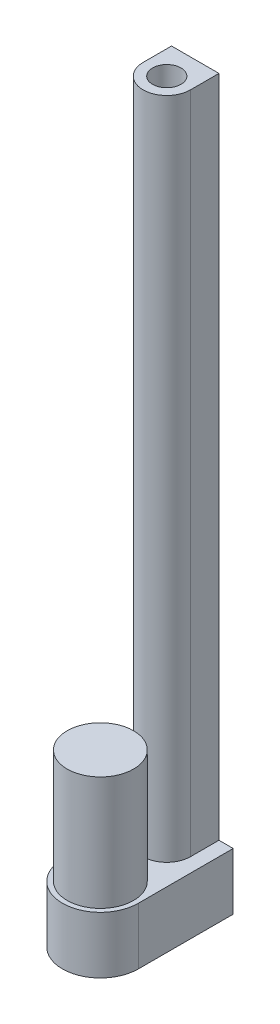
ISO-10303-21;
HEADER;
FILE_DESCRIPTION(('STEP AP214'),'2;1');
FILE_NAME('part.step','',(''),(''),'','','');
FILE_SCHEMA(('AUTOMOTIVE_DESIGN { 1 0 10303 214 1 1 1 1 }'));
ENDSEC;
DATA;
#1=APPLICATION_CONTEXT('core data for automotive mechanical design processes');
#2=APPLICATION_PROTOCOL_DEFINITION('international standard','automotive_design',2000,#1);
#3=PRODUCT_CONTEXT('',#1,'mechanical');
#4=PRODUCT('Part','Part','',(#3));
#5=PRODUCT_RELATED_PRODUCT_CATEGORY('part','',(#4));
#6=PRODUCT_DEFINITION_FORMATION('','',#4);
#7=PRODUCT_DEFINITION_CONTEXT('part definition',#1,'design');
#8=PRODUCT_DEFINITION('design','',#6,#7);
#9=PRODUCT_DEFINITION_SHAPE('','',#8);
#10=(LENGTH_UNIT() NAMED_UNIT(*) SI_UNIT(.MILLI.,.METRE.));
#11=(NAMED_UNIT(*) PLANE_ANGLE_UNIT() SI_UNIT($,.RADIAN.));
#12=(NAMED_UNIT(*) SI_UNIT($,.STERADIAN.) SOLID_ANGLE_UNIT());
#13=UNCERTAINTY_MEASURE_WITH_UNIT(LENGTH_MEASURE(1.E-05),#10,'distance_accuracy_value','');
#14=(GEOMETRIC_REPRESENTATION_CONTEXT(3) GLOBAL_UNCERTAINTY_ASSIGNED_CONTEXT((#13)) GLOBAL_UNIT_ASSIGNED_CONTEXT((#10,
#11,#12)) REPRESENTATION_CONTEXT('',''));
#15=CARTESIAN_POINT('',(0.,0.,0.));
#16=DIRECTION('',(0.,0.,1.));
#17=DIRECTION('',(1.,0.,0.));
#18=AXIS2_PLACEMENT_3D('',#15,#16,#17);
#19=CARTESIAN_POINT('',(0.,0.,50.));
#20=DIRECTION('',(0.,-1.,0.));
#21=DIRECTION('',(0.,0.,-1.));
#22=AXIS2_PLACEMENT_3D('',#19,#20,#21);
#23=PLANE('',#22);
#24=CARTESIAN_POINT('',(0.,0.,50.));
#25=DIRECTION('',(0.,1.,0.));
#26=DIRECTION('',(0.,0.,-1.));
#27=AXIS2_PLACEMENT_3D('',#24,#25,#26);
#28=CIRCLE('',#27,20.);
#29=CARTESIAN_POINT('',(-20.,0.,50.));
#30=VERTEX_POINT('',#29);
#31=CARTESIAN_POINT('',(20.,0.,50.));
#32=VERTEX_POINT('',#31);
#33=EDGE_CURVE('E215',#30,#32,#28,.T.);
#34=ORIENTED_EDGE('',*,*,#33,.F.);
#35=DIRECTION('',(0.,0.,1.));
#36=VECTOR('',#35,1.);
#37=CARTESIAN_POINT('',(-20.,0.,50.));
#38=LINE('',#37,#36);
#39=CARTESIAN_POINT('',(-20.,0.,0.));
#40=VERTEX_POINT('',#39);
#41=EDGE_CURVE('E221',#40,#30,#38,.T.);
#42=ORIENTED_EDGE('',*,*,#41,.F.);
#43=DIRECTION('',(-1.,0.,0.));
#44=VECTOR('',#43,1.);
#45=CARTESIAN_POINT('',(-20.,0.,0.));
#46=LINE('',#45,#44);
#47=CARTESIAN_POINT('',(20.,0.,0.));
#48=VERTEX_POINT('',#47);
#49=EDGE_CURVE('E238',#48,#40,#46,.T.);
#50=ORIENTED_EDGE('',*,*,#49,.F.);
#51=DIRECTION('',(0.,0.,-1.));
#52=VECTOR('',#51,1.);
#53=CARTESIAN_POINT('',(20.,0.,0.));
#54=LINE('',#53,#52);
#55=EDGE_CURVE('E235',#32,#48,#54,.T.);
#56=ORIENTED_EDGE('',*,*,#55,.F.);
#57=EDGE_LOOP('',(#34,#42,#50,#56));
#58=FACE_BOUND('',#57,.T.);
#59=DIRECTION('',(1.,0.,0.));
#60=VECTOR('',#59,1.);
#61=CARTESIAN_POINT('',(5.,0.,4.99999999999999));
#62=LINE('',#61,#60);
#63=CARTESIAN_POINT('',(-5.,0.,4.99999999999999));
#64=VERTEX_POINT('',#63);
#65=CARTESIAN_POINT('',(5.,0.,4.99999999999999));
#66=VERTEX_POINT('',#65);
#67=EDGE_CURVE('E426',#64,#66,#62,.T.);
#68=ORIENTED_EDGE('',*,*,#67,.F.);
#69=DIRECTION('',(0.,0.,-1.));
#70=VECTOR('',#69,1.);
#71=CARTESIAN_POINT('',(-5.,0.,4.99999999999999));
#72=LINE('',#71,#70);
#73=CARTESIAN_POINT('',(-5.,0.,15.));
#74=VERTEX_POINT('',#73);
#75=EDGE_CURVE('E161',#74,#64,#72,.T.);
#76=ORIENTED_EDGE('',*,*,#75,.F.);
#77=DIRECTION('',(-1.,0.,0.));
#78=VECTOR('',#77,1.);
#79=CARTESIAN_POINT('',(5.,0.,15.));
#80=LINE('',#79,#78);
#81=CARTESIAN_POINT('',(5.,0.,15.));
#82=VERTEX_POINT('',#81);
#83=EDGE_CURVE('E157',#82,#74,#80,.T.);
#84=ORIENTED_EDGE('',*,*,#83,.F.);
#85=DIRECTION('',(0.,0.,1.));
#86=VECTOR('',#85,1.);
#87=CARTESIAN_POINT('',(5.,0.,4.99999999999999));
#88=LINE('',#87,#86);
#89=EDGE_CURVE('E437',#66,#82,#88,.T.);
#90=ORIENTED_EDGE('',*,*,#89,.F.);
#91=EDGE_LOOP('',(#68,#76,#84,#90));
#92=FACE_BOUND('',#91,.T.);
#93=ADVANCED_FACE('F45',(#58,#92),#23,.T.);
#94=CARTESIAN_POINT('',(0.,30.,50.));
#95=DIRECTION('',(0.,-1.,0.));
#96=DIRECTION('',(0.,0.,-1.));
#97=AXIS2_PLACEMENT_3D('',#94,#95,#96);
#98=PLANE('',#97);
#99=CARTESIAN_POINT('',(0.,30.,50.));
#100=DIRECTION('',(0.,-1.,0.));
#101=DIRECTION('',(0.,0.,-1.));
#102=AXIS2_PLACEMENT_3D('',#99,#100,#101);
#103=CIRCLE('',#102,17.5);
#104=CARTESIAN_POINT('',(0.,30.,32.5));
#105=VERTEX_POINT('',#104);
#106=EDGE_CURVE('E11',#105,#105,#103,.F.);
#107=ORIENTED_EDGE('',*,*,#106,.F.);
#108=EDGE_LOOP('',(#107));
#109=FACE_BOUND('',#108,.T.);
#110=DIRECTION('',(0.,0.,1.));
#111=VECTOR('',#110,1.);
#112=CARTESIAN_POINT('',(-12.5,30.,0.));
#113=LINE('',#112,#111);
#114=CARTESIAN_POINT('',(-12.5,30.,0.));
#115=VERTEX_POINT('',#114);
#116=CARTESIAN_POINT('',(-12.5,30.,15.));
#117=VERTEX_POINT('',#116);
#118=EDGE_CURVE('E188',#115,#117,#113,.T.);
#119=ORIENTED_EDGE('',*,*,#118,.F.);
#120=DIRECTION('',(-1.,0.,0.));
#121=VECTOR('',#120,1.);
#122=CARTESIAN_POINT('',(-20.,30.,0.));
#123=LINE('',#122,#121);
#124=CARTESIAN_POINT('',(-20.,30.,0.));
#125=VERTEX_POINT('',#124);
#126=EDGE_CURVE('E224',#115,#125,#123,.T.);
#127=ORIENTED_EDGE('',*,*,#126,.T.);
#128=DIRECTION('',(0.,0.,1.));
#129=VECTOR('',#128,1.);
#130=CARTESIAN_POINT('',(-20.,30.,50.));
#131=LINE('',#130,#129);
#132=CARTESIAN_POINT('',(-20.,30.,50.));
#133=VERTEX_POINT('',#132);
#134=EDGE_CURVE('E228',#125,#133,#131,.T.);
#135=ORIENTED_EDGE('',*,*,#134,.T.);
#136=CARTESIAN_POINT('',(0.,30.,50.));
#137=DIRECTION('',(0.,1.,0.));
#138=DIRECTION('',(0.,0.,-1.));
#139=AXIS2_PLACEMENT_3D('',#136,#137,#138);
#140=CIRCLE('',#139,20.);
#141=CARTESIAN_POINT('',(20.,30.,50.));
#142=VERTEX_POINT('',#141);
#143=EDGE_CURVE('E216',#133,#142,#140,.T.);
#144=ORIENTED_EDGE('',*,*,#143,.T.);
#145=DIRECTION('',(0.,0.,-1.));
#146=VECTOR('',#145,1.);
#147=CARTESIAN_POINT('',(20.,30.,0.));
#148=LINE('',#147,#146);
#149=CARTESIAN_POINT('',(20.,30.,0.));
#150=VERTEX_POINT('',#149);
#151=EDGE_CURVE('E220',#142,#150,#148,.T.);
#152=ORIENTED_EDGE('',*,*,#151,.T.);
#153=CARTESIAN_POINT('',(12.5,30.,0.));
#154=VERTEX_POINT('',#153);
#155=EDGE_CURVE('E225',#150,#154,#123,.T.);
#156=ORIENTED_EDGE('',*,*,#155,.T.);
#157=DIRECTION('',(0.,0.,-1.));
#158=VECTOR('',#157,1.);
#159=CARTESIAN_POINT('',(12.5,30.,15.));
#160=LINE('',#159,#158);
#161=CARTESIAN_POINT('',(12.5,30.,15.));
#162=VERTEX_POINT('',#161);
#163=EDGE_CURVE('E178',#162,#154,#160,.T.);
#164=ORIENTED_EDGE('',*,*,#163,.F.);
#165=CARTESIAN_POINT('',(0.,30.,15.));
#166=DIRECTION('',(0.,1.,0.));
#167=DIRECTION('',(0.,0.,1.));
#168=AXIS2_PLACEMENT_3D('',#165,#166,#167);
#169=CIRCLE('',#168,12.5);
#170=EDGE_CURVE('E70',#117,#162,#169,.T.);
#171=ORIENTED_EDGE('',*,*,#170,.F.);
#172=EDGE_LOOP('',(#119,#127,#135,#144,#152,#156,#164,#171));
#173=FACE_BOUND('',#172,.T.);
#174=ADVANCED_FACE('F276',(#109,#173),#98,.F.);
#175=CARTESIAN_POINT('',(0.,30.,50.));
#176=DIRECTION('',(0.,-1.,0.));
#177=DIRECTION('',(0.,0.,-1.));
#178=AXIS2_PLACEMENT_3D('',#175,#176,#177);
#179=CYLINDRICAL_SURFACE('',#178,20.);
#180=ORIENTED_EDGE('',*,*,#33,.T.);
#181=DIRECTION('',(0.,-1.,0.));
#182=VECTOR('',#181,1.);
#183=CARTESIAN_POINT('',(20.,30.,50.));
#184=LINE('',#183,#182);
#185=EDGE_CURVE('E55',#142,#32,#184,.T.);
#186=ORIENTED_EDGE('',*,*,#185,.F.);
#187=ORIENTED_EDGE('',*,*,#143,.F.);
#188=DIRECTION('',(0.,-1.,0.));
#189=VECTOR('',#188,1.);
#190=CARTESIAN_POINT('',(-20.,30.,50.));
#191=LINE('',#190,#189);
#192=EDGE_CURVE('E231',#133,#30,#191,.T.);
#193=ORIENTED_EDGE('',*,*,#192,.T.);
#194=EDGE_LOOP('',(#180,#186,#187,#193));
#195=FACE_BOUND('',#194,.T.);
#196=ADVANCED_FACE('F47',(#195),#179,.T.);
#197=CARTESIAN_POINT('',(20.,30.,0.));
#198=DIRECTION('',(-1.,0.,0.));
#199=DIRECTION('',(0.,0.,1.));
#200=AXIS2_PLACEMENT_3D('',#197,#198,#199);
#201=PLANE('',#200);
#202=ORIENTED_EDGE('',*,*,#55,.T.);
#203=DIRECTION('',(0.,-1.,0.));
#204=VECTOR('',#203,1.);
#205=CARTESIAN_POINT('',(20.,30.,0.));
#206=LINE('',#205,#204);
#207=EDGE_CURVE('E250',#150,#48,#206,.T.);
#208=ORIENTED_EDGE('',*,*,#207,.F.);
#209=ORIENTED_EDGE('',*,*,#151,.F.);
#210=ORIENTED_EDGE('',*,*,#185,.T.);
#211=EDGE_LOOP('',(#202,#208,#209,#210));
#212=FACE_BOUND('',#211,.T.);
#213=ADVANCED_FACE('F258',(#212),#201,.F.);
#214=CARTESIAN_POINT('',(-20.,30.,0.));
#215=DIRECTION('',(0.,0.,1.));
#216=DIRECTION('',(1.,0.,0.));
#217=AXIS2_PLACEMENT_3D('',#214,#215,#216);
#218=PLANE('',#217);
#219=ORIENTED_EDGE('',*,*,#49,.T.);
#220=DIRECTION('',(0.,-1.,0.));
#221=VECTOR('',#220,1.);
#222=CARTESIAN_POINT('',(-20.,30.,0.));
#223=LINE('',#222,#221);
#224=EDGE_CURVE('E246',#125,#40,#223,.T.);
#225=ORIENTED_EDGE('',*,*,#224,.F.);
#226=ORIENTED_EDGE('',*,*,#126,.F.);
#227=DIRECTION('',(0.,-1.,0.));
#228=VECTOR('',#227,1.);
#229=CARTESIAN_POINT('',(-12.5,380.,0.));
#230=LINE('',#229,#228);
#231=CARTESIAN_POINT('',(-12.5,380.,0.));
#232=VERTEX_POINT('',#231);
#233=EDGE_CURVE('E207',#232,#115,#230,.T.);
#234=ORIENTED_EDGE('',*,*,#233,.F.);
#235=DIRECTION('',(-1.,0.,0.));
#236=VECTOR('',#235,1.);
#237=CARTESIAN_POINT('',(-12.5,380.,0.));
#238=LINE('',#237,#236);
#239=CARTESIAN_POINT('',(12.5,380.,0.));
#240=VERTEX_POINT('',#239);
#241=EDGE_CURVE('E173',#240,#232,#238,.T.);
#242=ORIENTED_EDGE('',*,*,#241,.F.);
#243=DIRECTION('',(0.,-1.,0.));
#244=VECTOR('',#243,1.);
#245=CARTESIAN_POINT('',(12.5,380.,0.));
#246=LINE('',#245,#244);
#247=EDGE_CURVE('E187',#240,#154,#246,.T.);
#248=ORIENTED_EDGE('',*,*,#247,.T.);
#249=ORIENTED_EDGE('',*,*,#155,.F.);
#250=ORIENTED_EDGE('',*,*,#207,.T.);
#251=EDGE_LOOP('',(#219,#225,#226,#234,#242,#248,#249,#250));
#252=FACE_BOUND('',#251,.T.);
#253=ADVANCED_FACE('F270',(#252),#218,.F.);
#254=CARTESIAN_POINT('',(-20.,30.,50.));
#255=DIRECTION('',(1.,0.,0.));
#256=DIRECTION('',(0.,0.,-1.));
#257=AXIS2_PLACEMENT_3D('',#254,#255,#256);
#258=PLANE('',#257);
#259=ORIENTED_EDGE('',*,*,#41,.T.);
#260=ORIENTED_EDGE('',*,*,#192,.F.);
#261=ORIENTED_EDGE('',*,*,#134,.F.);
#262=ORIENTED_EDGE('',*,*,#224,.T.);
#263=EDGE_LOOP('',(#259,#260,#261,#262));
#264=FACE_BOUND('',#263,.T.);
#265=ADVANCED_FACE('F275',(#264),#258,.F.);
#266=CARTESIAN_POINT('',(0.,90.,50.));
#267=DIRECTION('',(0.,-1.,0.));
#268=DIRECTION('',(0.,0.,-1.));
#269=AXIS2_PLACEMENT_3D('',#266,#267,#268);
#270=CYLINDRICAL_SURFACE('',#269,17.5);
#271=CARTESIAN_POINT('',(0.,90.,50.));
#272=DIRECTION('',(0.,1.,0.));
#273=DIRECTION('',(0.,0.,1.));
#274=AXIS2_PLACEMENT_3D('',#271,#272,#273);
#275=CIRCLE('',#274,17.5);
#276=CARTESIAN_POINT('',(0.,90.,67.5));
#277=VERTEX_POINT('',#276);
#278=EDGE_CURVE('E211',#277,#277,#275,.T.);
#279=ORIENTED_EDGE('',*,*,#278,.F.);
#280=EDGE_LOOP('',(#279));
#281=FACE_BOUND('',#280,.T.);
#282=ORIENTED_EDGE('',*,*,#106,.T.);
#283=EDGE_LOOP('',(#282));
#284=FACE_BOUND('',#283,.T.);
#285=ADVANCED_FACE('F311',(#281,#284),#270,.T.);
#286=CARTESIAN_POINT('',(0.,90.,50.));
#287=DIRECTION('',(0.,1.,0.));
#288=DIRECTION('',(0.,0.,1.));
#289=AXIS2_PLACEMENT_3D('',#286,#287,#288);
#290=PLANE('',#289);
#291=ORIENTED_EDGE('',*,*,#278,.T.);
#292=EDGE_LOOP('',(#291));
#293=FACE_BOUND('',#292,.T.);
#294=ADVANCED_FACE('F487',(#293),#290,.T.);
#295=CARTESIAN_POINT('',(-12.5,380.,0.));
#296=DIRECTION('',(1.,0.,0.));
#297=DIRECTION('',(0.,0.,-1.));
#298=AXIS2_PLACEMENT_3D('',#295,#296,#297);
#299=PLANE('',#298);
#300=ORIENTED_EDGE('',*,*,#118,.T.);
#301=DIRECTION('',(0.,-1.,0.));
#302=VECTOR('',#301,1.);
#303=CARTESIAN_POINT('',(-12.5,380.,15.));
#304=LINE('',#303,#302);
#305=CARTESIAN_POINT('',(-12.5,380.,15.));
#306=VERTEX_POINT('',#305);
#307=EDGE_CURVE('E203',#306,#117,#304,.T.);
#308=ORIENTED_EDGE('',*,*,#307,.F.);
#309=DIRECTION('',(0.,0.,1.));
#310=VECTOR('',#309,1.);
#311=CARTESIAN_POINT('',(-12.5,380.,0.));
#312=LINE('',#311,#310);
#313=EDGE_CURVE('E177',#232,#306,#312,.T.);
#314=ORIENTED_EDGE('',*,*,#313,.F.);
#315=ORIENTED_EDGE('',*,*,#233,.T.);
#316=EDGE_LOOP('',(#300,#308,#314,#315));
#317=FACE_BOUND('',#316,.T.);
#318=ADVANCED_FACE('F477',(#317),#299,.F.);
#319=CARTESIAN_POINT('',(0.,380.,15.));
#320=DIRECTION('',(0.,-1.,0.));
#321=DIRECTION('',(0.,0.,-1.));
#322=AXIS2_PLACEMENT_3D('',#319,#320,#321);
#323=CYLINDRICAL_SURFACE('',#322,12.5);
#324=ORIENTED_EDGE('',*,*,#170,.T.);
#325=DIRECTION('',(0.,-1.,0.));
#326=VECTOR('',#325,1.);
#327=CARTESIAN_POINT('',(12.5,380.,15.));
#328=LINE('',#327,#326);
#329=CARTESIAN_POINT('',(12.5,380.,15.));
#330=VERTEX_POINT('',#329);
#331=EDGE_CURVE('E199',#330,#162,#328,.T.);
#332=ORIENTED_EDGE('',*,*,#331,.F.);
#333=CARTESIAN_POINT('',(0.,380.,15.));
#334=DIRECTION('',(0.,1.,0.));
#335=DIRECTION('',(0.,0.,1.));
#336=AXIS2_PLACEMENT_3D('',#333,#334,#335);
#337=CIRCLE('',#336,12.5);
#338=EDGE_CURVE('E181',#306,#330,#337,.T.);
#339=ORIENTED_EDGE('',*,*,#338,.F.);
#340=ORIENTED_EDGE('',*,*,#307,.T.);
#341=EDGE_LOOP('',(#324,#332,#339,#340));
#342=FACE_BOUND('',#341,.T.);
#343=ADVANCED_FACE('F467',(#342),#323,.T.);
#344=CARTESIAN_POINT('',(12.5,380.,15.));
#345=DIRECTION('',(-1.,0.,0.));
#346=DIRECTION('',(0.,0.,1.));
#347=AXIS2_PLACEMENT_3D('',#344,#345,#346);
#348=PLANE('',#347);
#349=ORIENTED_EDGE('',*,*,#163,.T.);
#350=ORIENTED_EDGE('',*,*,#247,.F.);
#351=DIRECTION('',(0.,0.,-1.));
#352=VECTOR('',#351,1.);
#353=CARTESIAN_POINT('',(12.5,380.,15.));
#354=LINE('',#353,#352);
#355=EDGE_CURVE('E184',#330,#240,#354,.T.);
#356=ORIENTED_EDGE('',*,*,#355,.F.);
#357=ORIENTED_EDGE('',*,*,#331,.T.);
#358=EDGE_LOOP('',(#349,#350,#356,#357));
#359=FACE_BOUND('',#358,.T.);
#360=ADVANCED_FACE('F458',(#359),#348,.F.);
#361=CARTESIAN_POINT('',(0.,380.,15.));
#362=DIRECTION('',(0.,1.,0.));
#363=DIRECTION('',(0.,0.,1.));
#364=AXIS2_PLACEMENT_3D('',#361,#362,#363);
#365=PLANE('',#364);
#366=CARTESIAN_POINT('',(0.,380.,15.));
#367=DIRECTION('',(0.,1.,0.));
#368=DIRECTION('',(0.,0.,1.));
#369=AXIS2_PLACEMENT_3D('',#366,#367,#368);
#370=CIRCLE('',#369,7.5);
#371=CARTESIAN_POINT('',(0.,380.,7.5));
#372=VERTEX_POINT('',#371);
#373=EDGE_CURVE('E49',#372,#372,#370,.F.);
#374=ORIENTED_EDGE('',*,*,#373,.T.);
#375=EDGE_LOOP('',(#374));
#376=FACE_BOUND('',#375,.T.);
#377=ORIENTED_EDGE('',*,*,#241,.T.);
#378=ORIENTED_EDGE('',*,*,#313,.T.);
#379=ORIENTED_EDGE('',*,*,#338,.T.);
#380=ORIENTED_EDGE('',*,*,#355,.T.);
#381=EDGE_LOOP('',(#377,#378,#379,#380));
#382=FACE_BOUND('',#381,.T.);
#383=ADVANCED_FACE('F283',(#376,#382),#365,.T.);
#384=CARTESIAN_POINT('',(0.,380.000012,15.));
#385=DIRECTION('',(0.,-1.,0.));
#386=DIRECTION('',(0.,0.,-1.));
#387=AXIS2_PLACEMENT_3D('',#384,#385,#386);
#388=CYLINDRICAL_SURFACE('',#387,7.5);
#389=CARTESIAN_POINT('',(0.,30.,15.));
#390=DIRECTION('',(0.,1.,0.));
#391=DIRECTION('',(0.,0.,1.));
#392=AXIS2_PLACEMENT_3D('',#389,#390,#391);
#393=CIRCLE('',#392,7.5);
#394=CARTESIAN_POINT('',(0.,30.,7.5));
#395=VERTEX_POINT('',#394);
#396=EDGE_CURVE('E164',#395,#395,#393,.T.);
#397=CARTESIAN_POINT('',(0.,380.,7.5));
#398=CARTESIAN_POINT('',(0.,376.354166666667,7.5));
#399=CARTESIAN_POINT('',(0.,372.708333333333,7.5));
#400=CARTESIAN_POINT('',(0.,365.416666666667,7.5));
#401=CARTESIAN_POINT('',(0.,361.770833333333,7.5));
#402=CARTESIAN_POINT('',(0.,354.479166666667,7.5));
#403=CARTESIAN_POINT('',(0.,350.833333333333,7.5));
#404=CARTESIAN_POINT('',(0.,343.541666666667,7.5));
#405=CARTESIAN_POINT('',(0.,339.895833333333,7.5));
#406=CARTESIAN_POINT('',(0.,332.604166666667,7.5));
#407=CARTESIAN_POINT('',(0.,328.958333333333,7.5));
#408=CARTESIAN_POINT('',(0.,321.666666666667,7.5));
#409=CARTESIAN_POINT('',(0.,318.020833333333,7.5));
#410=CARTESIAN_POINT('',(0.,310.729166666667,7.5));
#411=CARTESIAN_POINT('',(0.,307.083333333333,7.5));
#412=CARTESIAN_POINT('',(0.,299.791666666667,7.5));
#413=CARTESIAN_POINT('',(0.,296.145833333333,7.5));
#414=CARTESIAN_POINT('',(0.,288.854166666667,7.5));
#415=CARTESIAN_POINT('',(0.,285.208333333333,7.5));
#416=CARTESIAN_POINT('',(0.,277.916666666667,7.5));
#417=CARTESIAN_POINT('',(0.,274.270833333333,7.5));
#418=CARTESIAN_POINT('',(0.,266.979166666667,7.5));
#419=CARTESIAN_POINT('',(0.,263.333333333333,7.5));
#420=CARTESIAN_POINT('',(0.,256.041666666667,7.5));
#421=CARTESIAN_POINT('',(0.,252.395833333333,7.5));
#422=CARTESIAN_POINT('',(0.,245.104166666667,7.5));
#423=CARTESIAN_POINT('',(0.,241.458333333333,7.5));
#424=CARTESIAN_POINT('',(0.,234.166666666667,7.5));
#425=CARTESIAN_POINT('',(0.,230.520833333333,7.5));
#426=CARTESIAN_POINT('',(0.,223.229166666667,7.5));
#427=CARTESIAN_POINT('',(0.,219.583333333333,7.5));
#428=CARTESIAN_POINT('',(0.,212.291666666667,7.5));
#429=CARTESIAN_POINT('',(0.,208.645833333333,7.5));
#430=CARTESIAN_POINT('',(0.,201.354166666667,7.5));
#431=CARTESIAN_POINT('',(0.,197.708333333333,7.5));
#432=CARTESIAN_POINT('',(0.,190.416666666667,7.5));
#433=CARTESIAN_POINT('',(0.,186.770833333333,7.5));
#434=CARTESIAN_POINT('',(0.,179.479166666667,7.5));
#435=CARTESIAN_POINT('',(0.,175.833333333333,7.5));
#436=CARTESIAN_POINT('',(0.,168.541666666667,7.5));
#437=CARTESIAN_POINT('',(0.,164.895833333333,7.5));
#438=CARTESIAN_POINT('',(0.,157.604166666667,7.5));
#439=CARTESIAN_POINT('',(0.,153.958333333333,7.5));
#440=CARTESIAN_POINT('',(0.,146.666666666667,7.5));
#441=CARTESIAN_POINT('',(0.,143.020833333333,7.5));
#442=CARTESIAN_POINT('',(0.,135.729166666667,7.5));
#443=CARTESIAN_POINT('',(0.,132.083333333333,7.5));
#444=CARTESIAN_POINT('',(0.,124.791666666667,7.5));
#445=CARTESIAN_POINT('',(0.,121.145833333333,7.5));
#446=CARTESIAN_POINT('',(0.,113.854166666667,7.5));
#447=CARTESIAN_POINT('',(0.,110.208333333333,7.5));
#448=CARTESIAN_POINT('',(0.,102.916666666667,7.5));
#449=CARTESIAN_POINT('',(0.,99.2708333333333,7.5));
#450=CARTESIAN_POINT('',(0.,91.9791666666666,7.5));
#451=CARTESIAN_POINT('',(0.,88.3333333333333,7.5));
#452=CARTESIAN_POINT('',(0.,81.0416666666666,7.5));
#453=CARTESIAN_POINT('',(0.,77.3958333333333,7.5));
#454=CARTESIAN_POINT('',(0.,70.1041666666666,7.5));
#455=CARTESIAN_POINT('',(0.,66.4583333333333,7.5));
#456=CARTESIAN_POINT('',(0.,59.1666666666666,7.5));
#457=CARTESIAN_POINT('',(0.,55.5208333333333,7.5));
#458=CARTESIAN_POINT('',(0.,48.2291666666666,7.5));
#459=CARTESIAN_POINT('',(0.,44.5833333333333,7.5));
#460=CARTESIAN_POINT('',(0.,37.2916666666666,7.5));
#461=CARTESIAN_POINT('',(0.,33.6458333333333,7.5));
#462=CARTESIAN_POINT('',(0.,30.,7.5));
#463=B_SPLINE_CURVE_WITH_KNOTS('',3,(#397,#398,#399,#400,#401,#402,#403,#404,#405,#406,#407,
#408,#409,#410,#411,#412,#413,#414,#415,#416,#417,#418,#419,#420,#421,#422,#423,#424,#425,#426,
#427,#428,#429,#430,#431,#432,#433,#434,#435,#436,#437,#438,#439,#440,#441,#442,#443,#444,#445,
#446,#447,#448,#449,#450,#451,#452,#453,#454,#455,#456,#457,#458,#459,#460,#461,#462),
.UNSPECIFIED.,.F.,.F.,(4,2,2,2,2,2,2,2,2,2,2,2,2,2,2,2,2,2,2,2,2,2,2,2,2,2,2,2,2,2,2,2,4),(0.,
10.9375,21.875,32.8125,43.75,54.6875,65.625,76.5625,87.5,98.4375,109.375,120.3125,131.25,
142.1875,153.125,164.0625,175.,185.9375,196.875,207.8125,218.75,229.6875,240.625,251.5625,262.5,
273.4375,284.375,295.3125,306.25,317.1875,328.125,339.0625,350.),.UNSPECIFIED.);
#464=EDGE_CURVE('BSEAM286',#372,#395,#463,.T.);
#465=ORIENTED_EDGE('',*,*,#373,.F.);
#466=ORIENTED_EDGE('',*,*,#396,.F.);
#467=ORIENTED_EDGE('',*,*,#464,.T.);
#468=ORIENTED_EDGE('',*,*,#464,.F.);
#469=EDGE_LOOP('',(#465,#467,#466,#468));
#470=FACE_BOUND('',#469,.T.);
#471=ADVANCED_FACE('F286',(#470),#388,.F.);
#472=CARTESIAN_POINT('',(0.,30.,15.));
#473=DIRECTION('',(0.,1.,0.));
#474=DIRECTION('',(0.,0.,1.));
#475=AXIS2_PLACEMENT_3D('',#472,#473,#474);
#476=PLANE('',#475);
#477=ORIENTED_EDGE('',*,*,#396,.T.);
#478=EDGE_LOOP('',(#477));
#479=FACE_BOUND('',#478,.T.);
#480=ADVANCED_FACE('F289',(#479),#476,.T.);
#481=CARTESIAN_POINT('',(-5.,-15.,4.99999999999999));
#482=DIRECTION('',(1.,0.,0.));
#483=DIRECTION('',(0.,0.,-1.));
#484=AXIS2_PLACEMENT_3D('',#481,#482,#483);
#485=PLANE('',#484);
#486=CARTESIAN_POINT('',(-5.,-10.,9.99999999999999));
#487=DIRECTION('',(1.,0.,0.));
#488=DIRECTION('',(0.,0.,-1.));
#489=AXIS2_PLACEMENT_3D('',#486,#487,#488);
#490=CIRCLE('',#489,3.);
#491=CARTESIAN_POINT('',(-5.,-10.,6.99999999999999));
#492=VERTEX_POINT('',#491);
#493=EDGE_CURVE('E421',#492,#492,#490,.T.);
#494=ORIENTED_EDGE('',*,*,#493,.T.);
#495=EDGE_LOOP('',(#494));
#496=FACE_BOUND('',#495,.T.);
#497=ORIENTED_EDGE('',*,*,#75,.T.);
#498=DIRECTION('',(0.,1.,0.));
#499=VECTOR('',#498,1.);
#500=CARTESIAN_POINT('',(-5.,-15.,4.99999999999999));
#501=LINE('',#500,#499);
#502=CARTESIAN_POINT('',(-5.,-15.,4.99999999999999));
#503=VERTEX_POINT('',#502);
#504=EDGE_CURVE('E140',#503,#64,#501,.T.);
#505=ORIENTED_EDGE('',*,*,#504,.F.);
#506=DIRECTION('',(0.,0.,-1.));
#507=VECTOR('',#506,1.);
#508=CARTESIAN_POINT('',(-5.,-15.,4.99999999999999));
#509=LINE('',#508,#507);
#510=CARTESIAN_POINT('',(-5.,-15.,15.));
#511=VERTEX_POINT('',#510);
#512=EDGE_CURVE('E148',#511,#503,#509,.T.);
#513=ORIENTED_EDGE('',*,*,#512,.F.);
#514=DIRECTION('',(0.,1.,0.));
#515=VECTOR('',#514,1.);
#516=CARTESIAN_POINT('',(-5.,-15.,15.));
#517=LINE('',#516,#515);
#518=EDGE_CURVE('E433',#511,#74,#517,.T.);
#519=ORIENTED_EDGE('',*,*,#518,.T.);
#520=EDGE_LOOP('',(#497,#505,#513,#519));
#521=FACE_BOUND('',#520,.T.);
#522=ADVANCED_FACE('F159',(#496,#521),#485,.F.);
#523=CARTESIAN_POINT('',(5.,-15.,4.99999999999999));
#524=DIRECTION('',(0.,0.,1.));
#525=DIRECTION('',(1.,0.,0.));
#526=AXIS2_PLACEMENT_3D('',#523,#524,#525);
#527=PLANE('',#526);
#528=ORIENTED_EDGE('',*,*,#67,.T.);
#529=DIRECTION('',(0.,1.,0.));
#530=VECTOR('',#529,1.);
#531=CARTESIAN_POINT('',(5.,-15.,4.99999999999999));
#532=LINE('',#531,#530);
#533=CARTESIAN_POINT('',(5.,-15.,4.99999999999999));
#534=VERTEX_POINT('',#533);
#535=EDGE_CURVE('E143',#534,#66,#532,.T.);
#536=ORIENTED_EDGE('',*,*,#535,.F.);
#537=DIRECTION('',(1.,0.,0.));
#538=VECTOR('',#537,1.);
#539=CARTESIAN_POINT('',(5.,-15.,4.99999999999999));
#540=LINE('',#539,#538);
#541=EDGE_CURVE('E136',#503,#534,#540,.T.);
#542=ORIENTED_EDGE('',*,*,#541,.F.);
#543=ORIENTED_EDGE('',*,*,#504,.T.);
#544=EDGE_LOOP('',(#528,#536,#542,#543));
#545=FACE_BOUND('',#544,.T.);
#546=ADVANCED_FACE('F138',(#545),#527,.F.);
#547=CARTESIAN_POINT('',(5.,-15.,4.99999999999999));
#548=DIRECTION('',(-1.,0.,0.));
#549=DIRECTION('',(0.,0.,1.));
#550=AXIS2_PLACEMENT_3D('',#547,#548,#549);
#551=PLANE('',#550);
#552=CARTESIAN_POINT('',(5.,-10.,9.99999999999999));
#553=DIRECTION('',(1.,0.,0.));
#554=DIRECTION('',(0.,0.,-1.));
#555=AXIS2_PLACEMENT_3D('',#552,#553,#554);
#556=CIRCLE('',#555,3.);
#557=CARTESIAN_POINT('',(5.,-10.,6.99999999999999));
#558=VERTEX_POINT('',#557);
#559=EDGE_CURVE('E418',#558,#558,#556,.T.);
#560=ORIENTED_EDGE('',*,*,#559,.F.);
#561=EDGE_LOOP('',(#560));
#562=FACE_BOUND('',#561,.T.);
#563=ORIENTED_EDGE('',*,*,#89,.T.);
#564=DIRECTION('',(0.,1.,0.));
#565=VECTOR('',#564,1.);
#566=CARTESIAN_POINT('',(5.,-15.,15.));
#567=LINE('',#566,#565);
#568=CARTESIAN_POINT('',(5.,-15.,15.));
#569=VERTEX_POINT('',#568);
#570=EDGE_CURVE('E62',#569,#82,#567,.T.);
#571=ORIENTED_EDGE('',*,*,#570,.F.);
#572=DIRECTION('',(0.,0.,1.));
#573=VECTOR('',#572,1.);
#574=CARTESIAN_POINT('',(5.,-15.,4.99999999999999));
#575=LINE('',#574,#573);
#576=EDGE_CURVE('E147',#534,#569,#575,.T.);
#577=ORIENTED_EDGE('',*,*,#576,.F.);
#578=ORIENTED_EDGE('',*,*,#535,.T.);
#579=EDGE_LOOP('',(#563,#571,#577,#578));
#580=FACE_BOUND('',#579,.T.);
#581=ADVANCED_FACE('F347',(#562,#580),#551,.F.);
#582=CARTESIAN_POINT('',(5.,-15.,15.));
#583=DIRECTION('',(0.,0.,-1.));
#584=DIRECTION('',(-1.,0.,0.));
#585=AXIS2_PLACEMENT_3D('',#582,#583,#584);
#586=PLANE('',#585);
#587=ORIENTED_EDGE('',*,*,#83,.T.);
#588=ORIENTED_EDGE('',*,*,#518,.F.);
#589=DIRECTION('',(-1.,0.,0.));
#590=VECTOR('',#589,1.);
#591=CARTESIAN_POINT('',(5.,-15.,15.));
#592=LINE('',#591,#590);
#593=EDGE_CURVE('E152',#569,#511,#592,.T.);
#594=ORIENTED_EDGE('',*,*,#593,.F.);
#595=ORIENTED_EDGE('',*,*,#570,.T.);
#596=EDGE_LOOP('',(#587,#588,#594,#595));
#597=FACE_BOUND('',#596,.T.);
#598=ADVANCED_FACE('F357',(#597),#586,.F.);
#599=CARTESIAN_POINT('',(0.,-15.,0.));
#600=DIRECTION('',(0.,-1.,0.));
#601=DIRECTION('',(0.,0.,-1.));
#602=AXIS2_PLACEMENT_3D('',#599,#600,#601);
#603=PLANE('',#602);
#604=ORIENTED_EDGE('',*,*,#512,.T.);
#605=ORIENTED_EDGE('',*,*,#541,.T.);
#606=ORIENTED_EDGE('',*,*,#576,.T.);
#607=ORIENTED_EDGE('',*,*,#593,.T.);
#608=EDGE_LOOP('',(#604,#605,#606,#607));
#609=FACE_BOUND('',#608,.T.);
#610=ADVANCED_FACE('F151',(#609),#603,.T.);
#611=CARTESIAN_POINT('',(-20.,-10.,9.99999999999998));
#612=DIRECTION('',(1.,0.,0.));
#613=DIRECTION('',(0.,0.,-1.));
#614=AXIS2_PLACEMENT_3D('',#611,#612,#613);
#615=CYLINDRICAL_SURFACE('',#614,3.);
#616=ORIENTED_EDGE('',*,*,#559,.T.);
#617=EDGE_LOOP('',(#616));
#618=FACE_BOUND('',#617,.T.);
#619=ORIENTED_EDGE('',*,*,#493,.F.);
#620=EDGE_LOOP('',(#619));
#621=FACE_BOUND('',#620,.T.);
#622=ADVANCED_FACE('F373',(#618,#621),#615,.F.);
#623=CLOSED_SHELL('',(#93,#174,#196,#213,#253,#265,#285,#294,#318,#343,#360,#383,#471,#480,#522,
#546,#581,#598,#610,#622));
#624=MANIFOLD_SOLID_BREP('B2',#623);
#625=ADVANCED_BREP_SHAPE_REPRESENTATION('',(#18,#624),#14);
#626=SHAPE_DEFINITION_REPRESENTATION(#9,#625);
ENDSEC;
END-ISO-10303-21;
